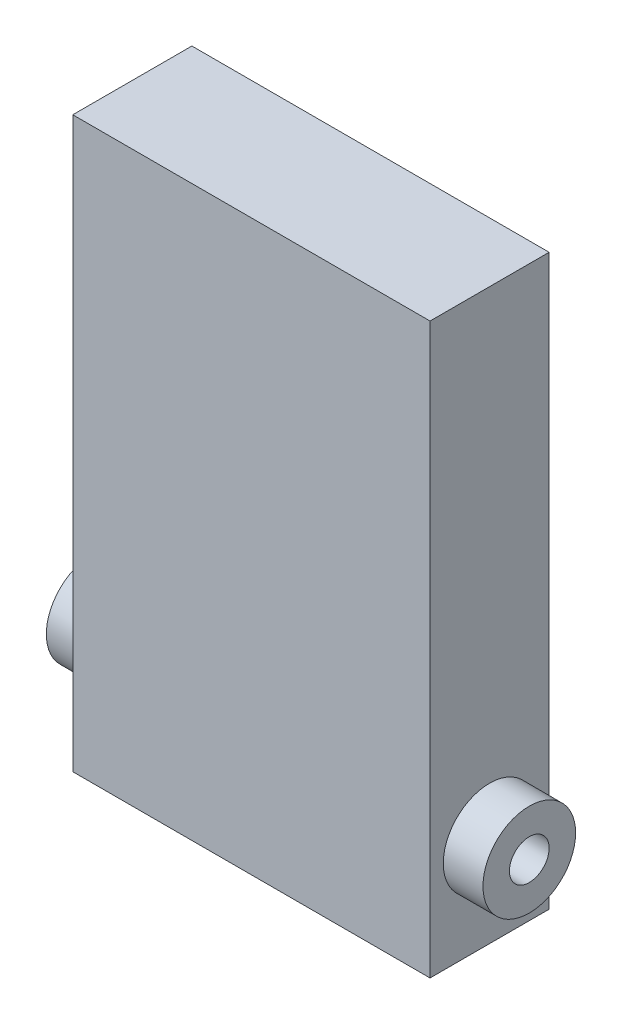
ISO-10303-21;
HEADER;
FILE_DESCRIPTION(('STEP AP214'),'2;1');
FILE_NAME('part.step','',(''),(''),'','','');
FILE_SCHEMA(('AUTOMOTIVE_DESIGN { 1 0 10303 214 1 1 1 1 }'));
ENDSEC;
DATA;
#1=APPLICATION_CONTEXT('core data for automotive mechanical design processes');
#2=APPLICATION_PROTOCOL_DEFINITION('international standard','automotive_design',2000,#1);
#3=PRODUCT_CONTEXT('',#1,'mechanical');
#4=PRODUCT('Part','Part','',(#3));
#5=PRODUCT_RELATED_PRODUCT_CATEGORY('part','',(#4));
#6=PRODUCT_DEFINITION_FORMATION('','',#4);
#7=PRODUCT_DEFINITION_CONTEXT('part definition',#1,'design');
#8=PRODUCT_DEFINITION('design','',#6,#7);
#9=PRODUCT_DEFINITION_SHAPE('','',#8);
#10=(LENGTH_UNIT() NAMED_UNIT(*) SI_UNIT(.MILLI.,.METRE.));
#11=(NAMED_UNIT(*) PLANE_ANGLE_UNIT() SI_UNIT($,.RADIAN.));
#12=(NAMED_UNIT(*) SI_UNIT($,.STERADIAN.) SOLID_ANGLE_UNIT());
#13=UNCERTAINTY_MEASURE_WITH_UNIT(LENGTH_MEASURE(1.E-05),#10,'distance_accuracy_value','');
#14=(GEOMETRIC_REPRESENTATION_CONTEXT(3) GLOBAL_UNCERTAINTY_ASSIGNED_CONTEXT((#13)) GLOBAL_UNIT_ASSIGNED_CONTEXT((#10,
#11,#12)) REPRESENTATION_CONTEXT('',''));
#15=CARTESIAN_POINT('',(0.,0.,0.));
#16=DIRECTION('',(0.,0.,1.));
#17=DIRECTION('',(1.,0.,0.));
#18=AXIS2_PLACEMENT_3D('',#15,#16,#17);
#19=CARTESIAN_POINT('',(13.5,21.5,4.5));
#20=DIRECTION('',(-1.,0.,0.));
#21=DIRECTION('',(0.,0.,1.));
#22=AXIS2_PLACEMENT_3D('',#19,#20,#21);
#23=PLANE('',#22);
#24=CARTESIAN_POINT('',(13.5,-14.5,0.));
#25=DIRECTION('',(-1.,0.,0.));
#26=DIRECTION('',(0.,0.,1.));
#27=AXIS2_PLACEMENT_3D('',#24,#25,#26);
#28=CIRCLE('',#27,3.5);
#29=CARTESIAN_POINT('',(13.5,-14.5,3.5));
#30=VERTEX_POINT('',#29);
#31=EDGE_CURVE('E11',#30,#30,#28,.F.);
#32=ORIENTED_EDGE('',*,*,#31,.F.);
#33=EDGE_LOOP('',(#32));
#34=FACE_BOUND('',#33,.T.);
#35=DIRECTION('',(0.,1.,0.));
#36=VECTOR('',#35,1.);
#37=CARTESIAN_POINT('',(13.5,21.5,-4.5));
#38=LINE('',#37,#36);
#39=CARTESIAN_POINT('',(13.5,-21.5,-4.5));
#40=VERTEX_POINT('',#39);
#41=CARTESIAN_POINT('',(13.5,21.5,-4.5));
#42=VERTEX_POINT('',#41);
#43=EDGE_CURVE('E110',#40,#42,#38,.T.);
#44=ORIENTED_EDGE('',*,*,#43,.T.);
#45=DIRECTION('',(0.,0.,-1.));
#46=VECTOR('',#45,1.);
#47=CARTESIAN_POINT('',(13.5,21.5,4.5));
#48=LINE('',#47,#46);
#49=CARTESIAN_POINT('',(13.5,21.5,4.5));
#50=VERTEX_POINT('',#49);
#51=EDGE_CURVE('E48',#50,#42,#48,.T.);
#52=ORIENTED_EDGE('',*,*,#51,.F.);
#53=DIRECTION('',(0.,1.,0.));
#54=VECTOR('',#53,1.);
#55=CARTESIAN_POINT('',(13.5,21.5,4.5));
#56=LINE('',#55,#54);
#57=CARTESIAN_POINT('',(13.5,-21.5,4.5));
#58=VERTEX_POINT('',#57);
#59=EDGE_CURVE('E92',#58,#50,#56,.T.);
#60=ORIENTED_EDGE('',*,*,#59,.F.);
#61=DIRECTION('',(0.,0.,-1.));
#62=VECTOR('',#61,1.);
#63=CARTESIAN_POINT('',(13.5,-21.5,4.5));
#64=LINE('',#63,#62);
#65=EDGE_CURVE('E106',#58,#40,#64,.T.);
#66=ORIENTED_EDGE('',*,*,#65,.T.);
#67=EDGE_LOOP('',(#44,#52,#60,#66));
#68=FACE_BOUND('',#67,.T.);
#69=ADVANCED_FACE('F39',(#34,#68),#23,.F.);
#70=CARTESIAN_POINT('',(-13.5,21.5,4.5));
#71=DIRECTION('',(0.,-1.,0.));
#72=DIRECTION('',(0.,0.,-1.));
#73=AXIS2_PLACEMENT_3D('',#70,#71,#72);
#74=PLANE('',#73);
#75=DIRECTION('',(-1.,0.,0.));
#76=VECTOR('',#75,1.);
#77=CARTESIAN_POINT('',(-13.5,21.5,-4.5));
#78=LINE('',#77,#76);
#79=CARTESIAN_POINT('',(-13.5,21.5,-4.5));
#80=VERTEX_POINT('',#79);
#81=EDGE_CURVE('E98',#42,#80,#78,.T.);
#82=ORIENTED_EDGE('',*,*,#81,.T.);
#83=DIRECTION('',(0.,0.,-1.));
#84=VECTOR('',#83,1.);
#85=CARTESIAN_POINT('',(-13.5,21.5,4.5));
#86=LINE('',#85,#84);
#87=CARTESIAN_POINT('',(-13.5,21.5,4.5));
#88=VERTEX_POINT('',#87);
#89=EDGE_CURVE('E96',#88,#80,#86,.T.);
#90=ORIENTED_EDGE('',*,*,#89,.F.);
#91=DIRECTION('',(-1.,0.,0.));
#92=VECTOR('',#91,1.);
#93=CARTESIAN_POINT('',(-13.5,21.5,4.5));
#94=LINE('',#93,#92);
#95=EDGE_CURVE('E87',#50,#88,#94,.T.);
#96=ORIENTED_EDGE('',*,*,#95,.F.);
#97=ORIENTED_EDGE('',*,*,#51,.T.);
#98=EDGE_LOOP('',(#82,#90,#96,#97));
#99=FACE_BOUND('',#98,.T.);
#100=ADVANCED_FACE('F97',(#99),#74,.F.);
#101=CARTESIAN_POINT('',(-13.5,21.5,4.5));
#102=DIRECTION('',(1.,0.,0.));
#103=DIRECTION('',(0.,0.,-1.));
#104=AXIS2_PLACEMENT_3D('',#101,#102,#103);
#105=PLANE('',#104);
#106=CARTESIAN_POINT('',(-13.5,-14.5,0.));
#107=DIRECTION('',(1.,0.,0.));
#108=DIRECTION('',(0.,0.,-1.));
#109=AXIS2_PLACEMENT_3D('',#106,#107,#108);
#110=CIRCLE('',#109,3.5);
#111=CARTESIAN_POINT('',(-13.5,-14.5,-3.5));
#112=VERTEX_POINT('',#111);
#113=EDGE_CURVE('E257',#112,#112,#110,.T.);
#114=ORIENTED_EDGE('',*,*,#113,.T.);
#115=EDGE_LOOP('',(#114));
#116=FACE_BOUND('',#115,.T.);
#117=DIRECTION('',(0.,-1.,0.));
#118=VECTOR('',#117,1.);
#119=CARTESIAN_POINT('',(-13.5,21.5,-4.5));
#120=LINE('',#119,#118);
#121=CARTESIAN_POINT('',(-13.5,-21.5,-4.5));
#122=VERTEX_POINT('',#121);
#123=EDGE_CURVE('E73',#80,#122,#120,.T.);
#124=ORIENTED_EDGE('',*,*,#123,.T.);
#125=DIRECTION('',(0.,0.,-1.));
#126=VECTOR('',#125,1.);
#127=CARTESIAN_POINT('',(-13.5,-21.5,4.5));
#128=LINE('',#127,#126);
#129=CARTESIAN_POINT('',(-13.5,-21.5,4.5));
#130=VERTEX_POINT('',#129);
#131=EDGE_CURVE('E100',#130,#122,#128,.T.);
#132=ORIENTED_EDGE('',*,*,#131,.F.);
#133=DIRECTION('',(0.,-1.,0.));
#134=VECTOR('',#133,1.);
#135=CARTESIAN_POINT('',(-13.5,21.5,4.5));
#136=LINE('',#135,#134);
#137=EDGE_CURVE('E90',#88,#130,#136,.T.);
#138=ORIENTED_EDGE('',*,*,#137,.F.);
#139=ORIENTED_EDGE('',*,*,#89,.T.);
#140=EDGE_LOOP('',(#124,#132,#138,#139));
#141=FACE_BOUND('',#140,.T.);
#142=ADVANCED_FACE('F102',(#116,#141),#105,.F.);
#143=CARTESIAN_POINT('',(-13.5,-21.5,4.5));
#144=DIRECTION('',(0.,1.,0.));
#145=DIRECTION('',(0.,0.,1.));
#146=AXIS2_PLACEMENT_3D('',#143,#144,#145);
#147=PLANE('',#146);
#148=DIRECTION('',(1.,0.,0.));
#149=VECTOR('',#148,1.);
#150=CARTESIAN_POINT('',(-13.5,-21.5,-4.5));
#151=LINE('',#150,#149);
#152=EDGE_CURVE('E79',#122,#40,#151,.T.);
#153=ORIENTED_EDGE('',*,*,#152,.T.);
#154=ORIENTED_EDGE('',*,*,#65,.F.);
#155=DIRECTION('',(1.,0.,0.));
#156=VECTOR('',#155,1.);
#157=CARTESIAN_POINT('',(-13.5,-21.5,4.5));
#158=LINE('',#157,#156);
#159=EDGE_CURVE('E56',#130,#58,#158,.T.);
#160=ORIENTED_EDGE('',*,*,#159,.F.);
#161=ORIENTED_EDGE('',*,*,#131,.T.);
#162=EDGE_LOOP('',(#153,#154,#160,#161));
#163=FACE_BOUND('',#162,.T.);
#164=ADVANCED_FACE('F139',(#163),#147,.F.);
#165=CARTESIAN_POINT('',(0.,0.,4.5));
#166=DIRECTION('',(0.,0.,1.));
#167=DIRECTION('',(1.,0.,0.));
#168=AXIS2_PLACEMENT_3D('',#165,#166,#167);
#169=PLANE('',#168);
#170=ORIENTED_EDGE('',*,*,#59,.T.);
#171=ORIENTED_EDGE('',*,*,#95,.T.);
#172=ORIENTED_EDGE('',*,*,#137,.T.);
#173=ORIENTED_EDGE('',*,*,#159,.T.);
#174=EDGE_LOOP('',(#170,#171,#172,#173));
#175=FACE_BOUND('',#174,.T.);
#176=ADVANCED_FACE('F88',(#175),#169,.T.);
#177=CARTESIAN_POINT('',(0.,0.,-4.5));
#178=DIRECTION('',(0.,0.,1.));
#179=DIRECTION('',(1.,0.,0.));
#180=AXIS2_PLACEMENT_3D('',#177,#178,#179);
#181=PLANE('',#180);
#182=ORIENTED_EDGE('',*,*,#43,.F.);
#183=ORIENTED_EDGE('',*,*,#152,.F.);
#184=ORIENTED_EDGE('',*,*,#123,.F.);
#185=ORIENTED_EDGE('',*,*,#81,.F.);
#186=EDGE_LOOP('',(#182,#183,#184,#185));
#187=FACE_BOUND('',#186,.T.);
#188=ADVANCED_FACE('F128',(#187),#181,.F.);
#189=CARTESIAN_POINT('',(16.5,-14.5,0.));
#190=DIRECTION('',(-1.,0.,0.));
#191=DIRECTION('',(0.,0.,1.));
#192=AXIS2_PLACEMENT_3D('',#189,#190,#191);
#193=CYLINDRICAL_SURFACE('',#192,3.5);
#194=CARTESIAN_POINT('',(16.5,-14.5,0.));
#195=DIRECTION('',(1.,0.,0.));
#196=DIRECTION('',(0.,0.,-1.));
#197=AXIS2_PLACEMENT_3D('',#194,#195,#196);
#198=CIRCLE('',#197,3.5);
#199=CARTESIAN_POINT('',(16.5,-14.5,-3.5));
#200=VERTEX_POINT('',#199);
#201=EDGE_CURVE('E114',#200,#200,#198,.T.);
#202=ORIENTED_EDGE('',*,*,#201,.F.);
#203=EDGE_LOOP('',(#202));
#204=FACE_BOUND('',#203,.T.);
#205=ORIENTED_EDGE('',*,*,#31,.T.);
#206=EDGE_LOOP('',(#205));
#207=FACE_BOUND('',#206,.T.);
#208=ADVANCED_FACE('F130',(#204,#207),#193,.T.);
#209=CARTESIAN_POINT('',(16.5,-14.5,0.));
#210=DIRECTION('',(1.,0.,0.));
#211=DIRECTION('',(0.,0.,-1.));
#212=AXIS2_PLACEMENT_3D('',#209,#210,#211);
#213=PLANE('',#212);
#214=CARTESIAN_POINT('',(16.5,-14.5,0.));
#215=DIRECTION('',(1.,0.,0.));
#216=DIRECTION('',(0.,0.,-1.));
#217=AXIS2_PLACEMENT_3D('',#214,#215,#216);
#218=CIRCLE('',#217,1.5);
#219=CARTESIAN_POINT('',(16.5,-14.5,-1.5));
#220=VERTEX_POINT('',#219);
#221=EDGE_CURVE('E270',#220,#220,#218,.T.);
#222=ORIENTED_EDGE('',*,*,#221,.F.);
#223=EDGE_LOOP('',(#222));
#224=FACE_BOUND('',#223,.T.);
#225=ORIENTED_EDGE('',*,*,#201,.T.);
#226=EDGE_LOOP('',(#225));
#227=FACE_BOUND('',#226,.T.);
#228=ADVANCED_FACE('F136',(#224,#227),#213,.T.);
#229=CARTESIAN_POINT('',(11.5,-14.5,0.));
#230=DIRECTION('',(1.,0.,0.));
#231=DIRECTION('',(0.,0.,-1.));
#232=AXIS2_PLACEMENT_3D('',#229,#230,#231);
#233=CYLINDRICAL_SURFACE('',#232,1.5);
#234=CARTESIAN_POINT('',(11.5,-14.5,0.));
#235=DIRECTION('',(1.,0.,0.));
#236=DIRECTION('',(0.,0.,-1.));
#237=AXIS2_PLACEMENT_3D('',#234,#235,#236);
#238=CIRCLE('',#237,1.5);
#239=CARTESIAN_POINT('',(11.5,-14.5,-1.5));
#240=VERTEX_POINT('',#239);
#241=EDGE_CURVE('E272',#240,#240,#238,.T.);
#242=ORIENTED_EDGE('',*,*,#241,.F.);
#243=EDGE_LOOP('',(#242));
#244=FACE_BOUND('',#243,.T.);
#245=ORIENTED_EDGE('',*,*,#221,.T.);
#246=EDGE_LOOP('',(#245));
#247=FACE_BOUND('',#246,.T.);
#248=ADVANCED_FACE('F188',(#244,#247),#233,.F.);
#249=CARTESIAN_POINT('',(11.5,-14.5,0.));
#250=DIRECTION('',(1.,0.,0.));
#251=DIRECTION('',(0.,0.,-1.));
#252=AXIS2_PLACEMENT_3D('',#249,#250,#251);
#253=PLANE('',#252);
#254=ORIENTED_EDGE('',*,*,#241,.T.);
#255=EDGE_LOOP('',(#254));
#256=FACE_BOUND('',#255,.T.);
#257=ADVANCED_FACE('F198',(#256),#253,.T.);
#258=CARTESIAN_POINT('',(-16.5,-14.5,0.));
#259=DIRECTION('',(1.,0.,0.));
#260=DIRECTION('',(0.,0.,-1.));
#261=AXIS2_PLACEMENT_3D('',#258,#259,#260);
#262=CYLINDRICAL_SURFACE('',#261,3.5);
#263=CARTESIAN_POINT('',(-16.5,-14.5,0.));
#264=DIRECTION('',(1.,0.,0.));
#265=DIRECTION('',(0.,0.,-1.));
#266=AXIS2_PLACEMENT_3D('',#263,#264,#265);
#267=CIRCLE('',#266,3.5);
#268=CARTESIAN_POINT('',(-16.5,-14.5,-3.5));
#269=VERTEX_POINT('',#268);
#270=EDGE_CURVE('E263',#269,#269,#267,.T.);
#271=ORIENTED_EDGE('',*,*,#270,.T.);
#272=EDGE_LOOP('',(#271));
#273=FACE_BOUND('',#272,.T.);
#274=ORIENTED_EDGE('',*,*,#113,.F.);
#275=EDGE_LOOP('',(#274));
#276=FACE_BOUND('',#275,.T.);
#277=ADVANCED_FACE('F207',(#273,#276),#262,.T.);
#278=CARTESIAN_POINT('',(-16.5,-14.5,0.));
#279=DIRECTION('',(-1.,0.,0.));
#280=DIRECTION('',(0.,0.,-1.));
#281=AXIS2_PLACEMENT_3D('',#278,#279,#280);
#282=PLANE('',#281);
#283=CARTESIAN_POINT('',(-16.5,-14.5,0.));
#284=DIRECTION('',(1.,0.,0.));
#285=DIRECTION('',(0.,0.,-1.));
#286=AXIS2_PLACEMENT_3D('',#283,#284,#285);
#287=CIRCLE('',#286,1.5);
#288=CARTESIAN_POINT('',(-16.5,-14.5,-1.5));
#289=VERTEX_POINT('',#288);
#290=EDGE_CURVE('E258',#289,#289,#287,.T.);
#291=ORIENTED_EDGE('',*,*,#290,.T.);
#292=EDGE_LOOP('',(#291));
#293=FACE_BOUND('',#292,.T.);
#294=ORIENTED_EDGE('',*,*,#270,.F.);
#295=EDGE_LOOP('',(#294));
#296=FACE_BOUND('',#295,.T.);
#297=ADVANCED_FACE('F219',(#293,#296),#282,.T.);
#298=CARTESIAN_POINT('',(-11.5,-14.5,0.));
#299=DIRECTION('',(-1.,0.,0.));
#300=DIRECTION('',(0.,0.,1.));
#301=AXIS2_PLACEMENT_3D('',#298,#299,#300);
#302=CYLINDRICAL_SURFACE('',#301,1.5);
#303=CARTESIAN_POINT('',(-11.5,-14.5,0.));
#304=DIRECTION('',(1.,0.,0.));
#305=DIRECTION('',(0.,0.,-1.));
#306=AXIS2_PLACEMENT_3D('',#303,#304,#305);
#307=CIRCLE('',#306,1.5);
#308=CARTESIAN_POINT('',(-11.5,-14.5,-1.5));
#309=VERTEX_POINT('',#308);
#310=EDGE_CURVE('E255',#309,#309,#307,.T.);
#311=ORIENTED_EDGE('',*,*,#310,.T.);
#312=EDGE_LOOP('',(#311));
#313=FACE_BOUND('',#312,.T.);
#314=ORIENTED_EDGE('',*,*,#290,.F.);
#315=EDGE_LOOP('',(#314));
#316=FACE_BOUND('',#315,.T.);
#317=ADVANCED_FACE('F229',(#313,#316),#302,.F.);
#318=CARTESIAN_POINT('',(-11.5,-14.5,0.));
#319=DIRECTION('',(-1.,0.,0.));
#320=DIRECTION('',(0.,0.,-1.));
#321=AXIS2_PLACEMENT_3D('',#318,#319,#320);
#322=PLANE('',#321);
#323=ORIENTED_EDGE('',*,*,#310,.F.);
#324=EDGE_LOOP('',(#323));
#325=FACE_BOUND('',#324,.T.);
#326=ADVANCED_FACE('F239',(#325),#322,.T.);
#327=CLOSED_SHELL('',(#69,#100,#142,#164,#176,#188,#208,#228,#248,#257,#277,#297,#317,#326));
#328=MANIFOLD_SOLID_BREP('B2',#327);
#329=ADVANCED_BREP_SHAPE_REPRESENTATION('',(#18,#328),#14);
#330=SHAPE_DEFINITION_REPRESENTATION(#9,#329);
ENDSEC;
END-ISO-10303-21;
